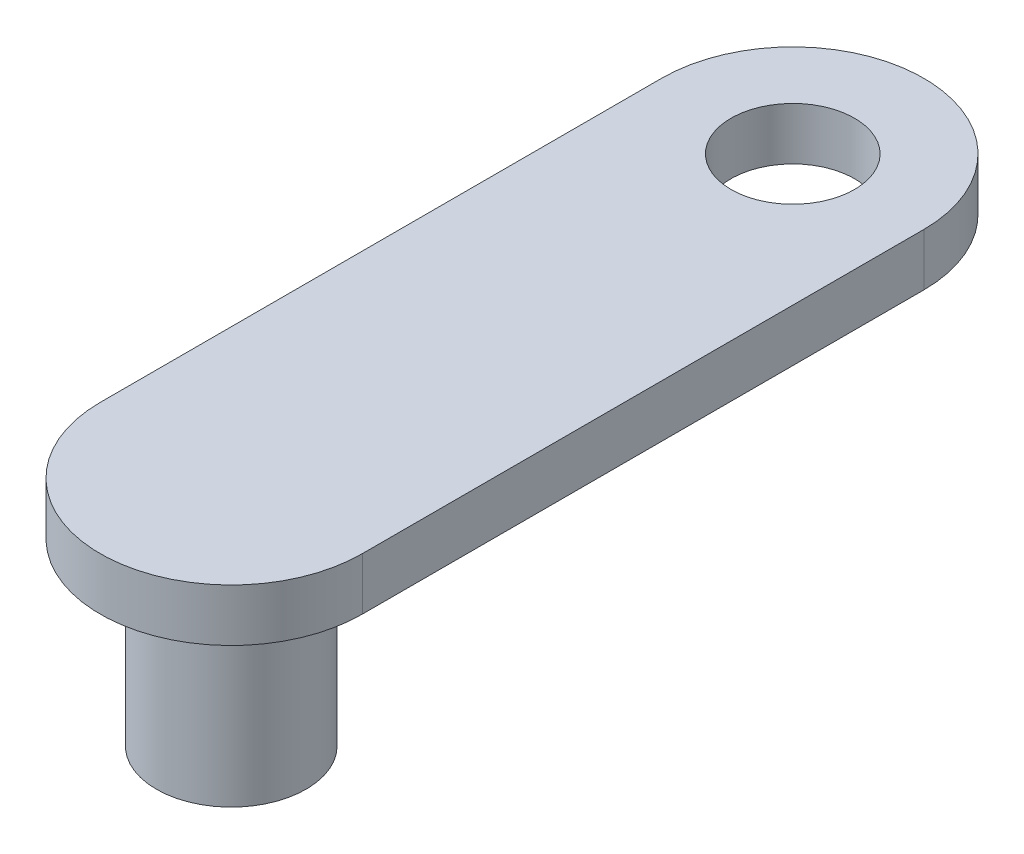
ISO-10303-21;
HEADER;
FILE_DESCRIPTION(('STEP AP214'),'2;1');
FILE_NAME('part.step','',(''),(''),'','','');
FILE_SCHEMA(('AUTOMOTIVE_DESIGN { 1 0 10303 214 1 1 1 1 }'));
ENDSEC;
DATA;
#1=APPLICATION_CONTEXT('core data for automotive mechanical design processes');
#2=APPLICATION_PROTOCOL_DEFINITION('international standard','automotive_design',2000,#1);
#3=PRODUCT_CONTEXT('',#1,'mechanical');
#4=PRODUCT('Part','Part','',(#3));
#5=PRODUCT_RELATED_PRODUCT_CATEGORY('part','',(#4));
#6=PRODUCT_DEFINITION_FORMATION('','',#4);
#7=PRODUCT_DEFINITION_CONTEXT('part definition',#1,'design');
#8=PRODUCT_DEFINITION('design','',#6,#7);
#9=PRODUCT_DEFINITION_SHAPE('','',#8);
#10=(LENGTH_UNIT() NAMED_UNIT(*) SI_UNIT(.MILLI.,.METRE.));
#11=(NAMED_UNIT(*) PLANE_ANGLE_UNIT() SI_UNIT($,.RADIAN.));
#12=(NAMED_UNIT(*) SI_UNIT($,.STERADIAN.) SOLID_ANGLE_UNIT());
#13=UNCERTAINTY_MEASURE_WITH_UNIT(LENGTH_MEASURE(1.E-05),#10,'distance_accuracy_value','');
#14=(GEOMETRIC_REPRESENTATION_CONTEXT(3) GLOBAL_UNCERTAINTY_ASSIGNED_CONTEXT((#13)) GLOBAL_UNIT_ASSIGNED_CONTEXT((#10,
#11,#12)) REPRESENTATION_CONTEXT('',''));
#15=CARTESIAN_POINT('',(0.,0.,0.));
#16=DIRECTION('',(0.,0.,1.));
#17=DIRECTION('',(1.,0.,0.));
#18=AXIS2_PLACEMENT_3D('',#15,#16,#17);
#19=CARTESIAN_POINT('',(0.,4.8,0.));
#20=DIRECTION('',(0.,-1.,0.));
#21=DIRECTION('',(0.,0.,-1.));
#22=AXIS2_PLACEMENT_3D('',#19,#20,#21);
#23=CYLINDRICAL_SURFACE('',#22,2.);
#24=CARTESIAN_POINT('',(0.,4.8,0.));
#25=DIRECTION('',(0.,1.,0.));
#26=DIRECTION('',(0.,0.,1.));
#27=AXIS2_PLACEMENT_3D('',#24,#25,#26);
#28=CIRCLE('',#27,2.);
#29=CARTESIAN_POINT('',(0.,4.8,2.));
#30=VERTEX_POINT('',#29);
#31=EDGE_CURVE('E11',#30,#30,#28,.T.);
#32=ORIENTED_EDGE('',*,*,#31,.F.);
#33=EDGE_LOOP('',(#32));
#34=FACE_BOUND('',#33,.T.);
#35=CARTESIAN_POINT('',(0.,0.,0.));
#36=DIRECTION('',(0.,1.,0.));
#37=DIRECTION('',(0.,0.,1.));
#38=AXIS2_PLACEMENT_3D('',#35,#36,#37);
#39=CIRCLE('',#38,2.);
#40=CARTESIAN_POINT('',(0.,0.,2.));
#41=VERTEX_POINT('',#40);
#42=EDGE_CURVE('E41',#41,#41,#39,.T.);
#43=ORIENTED_EDGE('',*,*,#42,.T.);
#44=EDGE_LOOP('',(#43));
#45=FACE_BOUND('',#44,.T.);
#46=ADVANCED_FACE('F38',(#34,#45),#23,.T.);
#47=CARTESIAN_POINT('',(0.,0.,0.));
#48=DIRECTION('',(0.,1.,0.));
#49=DIRECTION('',(0.,0.,1.));
#50=AXIS2_PLACEMENT_3D('',#47,#48,#49);
#51=PLANE('',#50);
#52=ORIENTED_EDGE('',*,*,#42,.F.);
#53=EDGE_LOOP('',(#52));
#54=FACE_BOUND('',#53,.T.);
#55=ADVANCED_FACE('F119',(#54),#51,.F.);
#56=CARTESIAN_POINT('',(0.,6.2,0.));
#57=DIRECTION('',(0.,1.,0.));
#58=DIRECTION('',(0.,0.,1.));
#59=AXIS2_PLACEMENT_3D('',#56,#57,#58);
#60=PLANE('',#59);
#61=CARTESIAN_POINT('',(0.,6.2,0.));
#62=DIRECTION('',(0.,1.,0.));
#63=DIRECTION('',(0.,0.,1.));
#64=AXIS2_PLACEMENT_3D('',#61,#62,#63);
#65=CIRCLE('',#64,3.5);
#66=CARTESIAN_POINT('',(-3.5,6.2,0.));
#67=VERTEX_POINT('',#66);
#68=CARTESIAN_POINT('',(3.5,6.2,0.));
#69=VERTEX_POINT('',#68);
#70=EDGE_CURVE('E91',#67,#69,#65,.T.);
#71=ORIENTED_EDGE('',*,*,#70,.T.);
#72=DIRECTION('',(0.,0.,-1.));
#73=VECTOR('',#72,1.);
#74=CARTESIAN_POINT('',(3.5,6.2,0.));
#75=LINE('',#74,#73);
#76=CARTESIAN_POINT('',(3.5,6.2,-15.));
#77=VERTEX_POINT('',#76);
#78=EDGE_CURVE('E85',#69,#77,#75,.T.);
#79=ORIENTED_EDGE('',*,*,#78,.T.);
#80=CARTESIAN_POINT('',(0.,6.2,-15.));
#81=DIRECTION('',(0.,1.,0.));
#82=DIRECTION('',(0.,0.,1.));
#83=AXIS2_PLACEMENT_3D('',#80,#81,#82);
#84=CIRCLE('',#83,3.5);
#85=CARTESIAN_POINT('',(-3.5,6.2,-15.));
#86=VERTEX_POINT('',#85);
#87=EDGE_CURVE('E89',#77,#86,#84,.T.);
#88=ORIENTED_EDGE('',*,*,#87,.T.);
#89=DIRECTION('',(0.,0.,1.));
#90=VECTOR('',#89,1.);
#91=CARTESIAN_POINT('',(-3.5,6.2,0.));
#92=LINE('',#91,#90);
#93=EDGE_CURVE('E54',#86,#67,#92,.T.);
#94=ORIENTED_EDGE('',*,*,#93,.T.);
#95=EDGE_LOOP('',(#71,#79,#88,#94));
#96=FACE_BOUND('',#95,.T.);
#97=CARTESIAN_POINT('',(0.,6.2,-15.));
#98=DIRECTION('',(0.,1.,0.));
#99=DIRECTION('',(0.,0.,1.));
#100=AXIS2_PLACEMENT_3D('',#97,#98,#99);
#101=CIRCLE('',#100,1.65);
#102=CARTESIAN_POINT('',(0.,6.2,-13.35));
#103=VERTEX_POINT('',#102);
#104=EDGE_CURVE('E109',#103,#103,#101,.T.);
#105=ORIENTED_EDGE('',*,*,#104,.F.);
#106=EDGE_LOOP('',(#105));
#107=FACE_BOUND('',#106,.T.);
#108=ADVANCED_FACE('F86',(#96,#107),#60,.T.);
#109=CARTESIAN_POINT('',(0.,4.8,0.));
#110=DIRECTION('',(0.,1.,0.));
#111=DIRECTION('',(0.,0.,1.));
#112=AXIS2_PLACEMENT_3D('',#109,#110,#111);
#113=PLANE('',#112);
#114=ORIENTED_EDGE('',*,*,#31,.T.);
#115=EDGE_LOOP('',(#114));
#116=FACE_BOUND('',#115,.T.);
#117=CARTESIAN_POINT('',(0.,4.8,0.));
#118=DIRECTION('',(0.,1.,0.));
#119=DIRECTION('',(0.,0.,1.));
#120=AXIS2_PLACEMENT_3D('',#117,#118,#119);
#121=CIRCLE('',#120,3.5);
#122=CARTESIAN_POINT('',(-3.5,4.8,0.));
#123=VERTEX_POINT('',#122);
#124=CARTESIAN_POINT('',(3.5,4.8,0.));
#125=VERTEX_POINT('',#124);
#126=EDGE_CURVE('E106',#123,#125,#121,.T.);
#127=ORIENTED_EDGE('',*,*,#126,.F.);
#128=DIRECTION('',(0.,0.,1.));
#129=VECTOR('',#128,1.);
#130=CARTESIAN_POINT('',(-3.5,4.8,0.));
#131=LINE('',#130,#129);
#132=CARTESIAN_POINT('',(-3.5,4.8,-15.));
#133=VERTEX_POINT('',#132);
#134=EDGE_CURVE('E77',#133,#123,#131,.T.);
#135=ORIENTED_EDGE('',*,*,#134,.F.);
#136=CARTESIAN_POINT('',(0.,4.8,-15.));
#137=DIRECTION('',(0.,1.,0.));
#138=DIRECTION('',(0.,0.,1.));
#139=AXIS2_PLACEMENT_3D('',#136,#137,#138);
#140=CIRCLE('',#139,3.5);
#141=CARTESIAN_POINT('',(3.5,4.8,-15.));
#142=VERTEX_POINT('',#141);
#143=EDGE_CURVE('E71',#142,#133,#140,.T.);
#144=ORIENTED_EDGE('',*,*,#143,.F.);
#145=DIRECTION('',(0.,0.,-1.));
#146=VECTOR('',#145,1.);
#147=CARTESIAN_POINT('',(3.5,4.8,0.));
#148=LINE('',#147,#146);
#149=EDGE_CURVE('E96',#125,#142,#148,.T.);
#150=ORIENTED_EDGE('',*,*,#149,.F.);
#151=EDGE_LOOP('',(#127,#135,#144,#150));
#152=FACE_BOUND('',#151,.T.);
#153=CARTESIAN_POINT('',(0.,4.8,-15.));
#154=DIRECTION('',(0.,1.,0.));
#155=DIRECTION('',(0.,0.,1.));
#156=AXIS2_PLACEMENT_3D('',#153,#154,#155);
#157=CIRCLE('',#156,1.65);
#158=CARTESIAN_POINT('',(0.,4.8,-13.35));
#159=VERTEX_POINT('',#158);
#160=EDGE_CURVE('E153',#159,#159,#157,.T.);
#161=ORIENTED_EDGE('',*,*,#160,.T.);
#162=EDGE_LOOP('',(#161));
#163=FACE_BOUND('',#162,.T.);
#164=ADVANCED_FACE('F125',(#116,#152,#163),#113,.F.);
#165=CARTESIAN_POINT('',(0.,6.2,0.));
#166=DIRECTION('',(0.,-1.,0.));
#167=DIRECTION('',(0.,0.,-1.));
#168=AXIS2_PLACEMENT_3D('',#165,#166,#167);
#169=CYLINDRICAL_SURFACE('',#168,3.5);
#170=ORIENTED_EDGE('',*,*,#126,.T.);
#171=DIRECTION('',(0.,-1.,0.));
#172=VECTOR('',#171,1.);
#173=CARTESIAN_POINT('',(3.5,6.2,0.));
#174=LINE('',#173,#172);
#175=EDGE_CURVE('E97',#69,#125,#174,.T.);
#176=ORIENTED_EDGE('',*,*,#175,.F.);
#177=ORIENTED_EDGE('',*,*,#70,.F.);
#178=DIRECTION('',(0.,-1.,0.));
#179=VECTOR('',#178,1.);
#180=CARTESIAN_POINT('',(-3.5,6.2,0.));
#181=LINE('',#180,#179);
#182=EDGE_CURVE('E102',#67,#123,#181,.T.);
#183=ORIENTED_EDGE('',*,*,#182,.T.);
#184=EDGE_LOOP('',(#170,#176,#177,#183));
#185=FACE_BOUND('',#184,.T.);
#186=ADVANCED_FACE('F129',(#185),#169,.T.);
#187=CARTESIAN_POINT('',(3.5,6.2,0.));
#188=DIRECTION('',(-1.,0.,0.));
#189=DIRECTION('',(0.,0.,1.));
#190=AXIS2_PLACEMENT_3D('',#187,#188,#189);
#191=PLANE('',#190);
#192=ORIENTED_EDGE('',*,*,#149,.T.);
#193=DIRECTION('',(0.,-1.,0.));
#194=VECTOR('',#193,1.);
#195=CARTESIAN_POINT('',(3.5,6.2,-15.));
#196=LINE('',#195,#194);
#197=EDGE_CURVE('E94',#77,#142,#196,.T.);
#198=ORIENTED_EDGE('',*,*,#197,.F.);
#199=ORIENTED_EDGE('',*,*,#78,.F.);
#200=ORIENTED_EDGE('',*,*,#175,.T.);
#201=EDGE_LOOP('',(#192,#198,#199,#200));
#202=FACE_BOUND('',#201,.T.);
#203=ADVANCED_FACE('F95',(#202),#191,.F.);
#204=CARTESIAN_POINT('',(0.,6.2,-15.));
#205=DIRECTION('',(0.,-1.,0.));
#206=DIRECTION('',(0.,0.,-1.));
#207=AXIS2_PLACEMENT_3D('',#204,#205,#206);
#208=CYLINDRICAL_SURFACE('',#207,3.5);
#209=ORIENTED_EDGE('',*,*,#143,.T.);
#210=DIRECTION('',(0.,-1.,0.));
#211=VECTOR('',#210,1.);
#212=CARTESIAN_POINT('',(-3.5,6.2,-15.));
#213=LINE('',#212,#211);
#214=EDGE_CURVE('E98',#86,#133,#213,.T.);
#215=ORIENTED_EDGE('',*,*,#214,.F.);
#216=ORIENTED_EDGE('',*,*,#87,.F.);
#217=ORIENTED_EDGE('',*,*,#197,.T.);
#218=EDGE_LOOP('',(#209,#215,#216,#217));
#219=FACE_BOUND('',#218,.T.);
#220=ADVANCED_FACE('F100',(#219),#208,.T.);
#221=CARTESIAN_POINT('',(-3.5,6.2,0.));
#222=DIRECTION('',(1.,0.,0.));
#223=DIRECTION('',(0.,0.,-1.));
#224=AXIS2_PLACEMENT_3D('',#221,#222,#223);
#225=PLANE('',#224);
#226=ORIENTED_EDGE('',*,*,#134,.T.);
#227=ORIENTED_EDGE('',*,*,#182,.F.);
#228=ORIENTED_EDGE('',*,*,#93,.F.);
#229=ORIENTED_EDGE('',*,*,#214,.T.);
#230=EDGE_LOOP('',(#226,#227,#228,#229));
#231=FACE_BOUND('',#230,.T.);
#232=ADVANCED_FACE('F137',(#231),#225,.F.);
#233=CARTESIAN_POINT('',(0.,6.2,-15.));
#234=DIRECTION('',(0.,-1.,0.));
#235=DIRECTION('',(0.,0.,-1.));
#236=AXIS2_PLACEMENT_3D('',#233,#234,#235);
#237=CYLINDRICAL_SURFACE('',#236,1.65);
#238=ORIENTED_EDGE('',*,*,#104,.T.);
#239=EDGE_LOOP('',(#238));
#240=FACE_BOUND('',#239,.T.);
#241=ORIENTED_EDGE('',*,*,#160,.F.);
#242=EDGE_LOOP('',(#241));
#243=FACE_BOUND('',#242,.T.);
#244=ADVANCED_FACE('F140',(#240,#243),#237,.F.);
#245=CLOSED_SHELL('',(#46,#55,#108,#164,#186,#203,#220,#232,#244));
#246=MANIFOLD_SOLID_BREP('B2',#245);
#247=ADVANCED_BREP_SHAPE_REPRESENTATION('',(#18,#246),#14);
#248=SHAPE_DEFINITION_REPRESENTATION(#9,#247);
ENDSEC;
END-ISO-10303-21;
